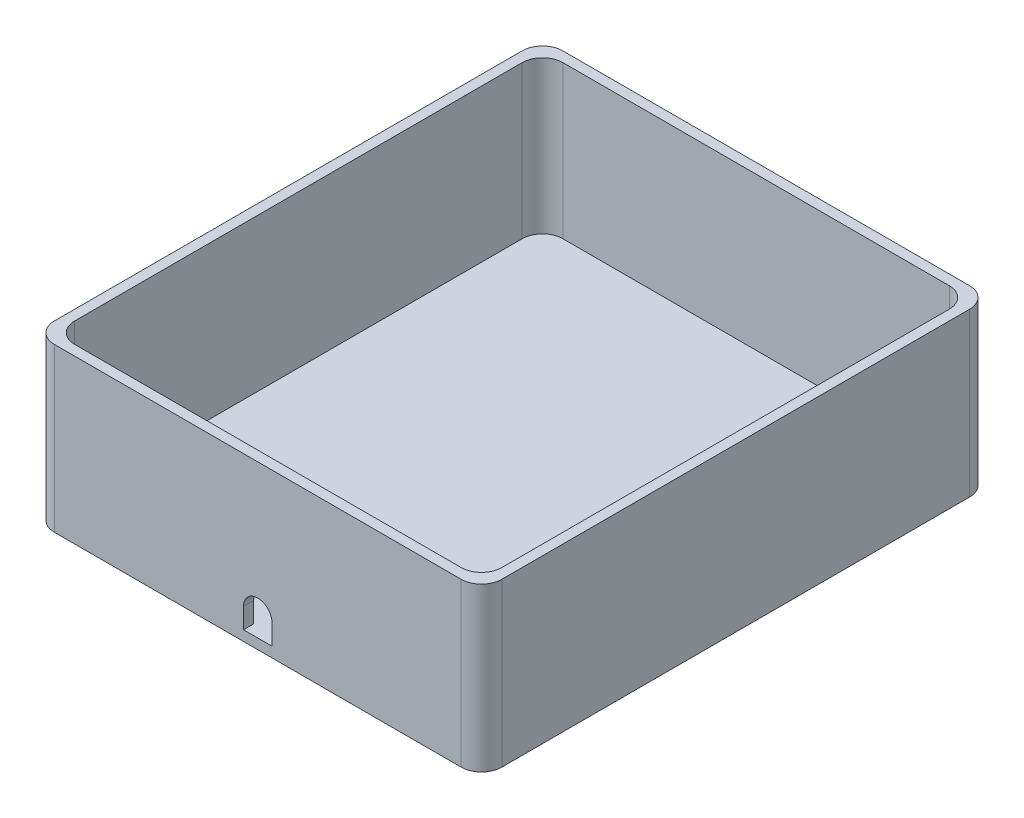
ISO-10303-21;
HEADER;
FILE_DESCRIPTION(('STEP AP214'),'2;1');
FILE_NAME('part.step','',(''),(''),'','','');
FILE_SCHEMA(('AUTOMOTIVE_DESIGN { 1 0 10303 214 1 1 1 1 }'));
ENDSEC;
DATA;
#1=APPLICATION_CONTEXT('core data for automotive mechanical design processes');
#2=APPLICATION_PROTOCOL_DEFINITION('international standard','automotive_design',2000,#1);
#3=PRODUCT_CONTEXT('',#1,'mechanical');
#4=PRODUCT('Part','Part','',(#3));
#5=PRODUCT_RELATED_PRODUCT_CATEGORY('part','',(#4));
#6=PRODUCT_DEFINITION_FORMATION('','',#4);
#7=PRODUCT_DEFINITION_CONTEXT('part definition',#1,'design');
#8=PRODUCT_DEFINITION('design','',#6,#7);
#9=PRODUCT_DEFINITION_SHAPE('','',#8);
#10=(LENGTH_UNIT() NAMED_UNIT(*) SI_UNIT(.MILLI.,.METRE.));
#11=(NAMED_UNIT(*) PLANE_ANGLE_UNIT() SI_UNIT($,.RADIAN.));
#12=(NAMED_UNIT(*) SI_UNIT($,.STERADIAN.) SOLID_ANGLE_UNIT());
#13=UNCERTAINTY_MEASURE_WITH_UNIT(LENGTH_MEASURE(1.E-05),#10,'distance_accuracy_value','');
#14=(GEOMETRIC_REPRESENTATION_CONTEXT(3) GLOBAL_UNCERTAINTY_ASSIGNED_CONTEXT((#13)) GLOBAL_UNIT_ASSIGNED_CONTEXT((#10,
#11,#12)) REPRESENTATION_CONTEXT('',''));
#15=CARTESIAN_POINT('',(0.,0.,0.));
#16=DIRECTION('',(0.,0.,1.));
#17=DIRECTION('',(1.,0.,0.));
#18=AXIS2_PLACEMENT_3D('',#15,#16,#17);
#19=CARTESIAN_POINT('',(-110.,80.,125.));
#20=DIRECTION('',(1.,0.,0.));
#21=DIRECTION('',(0.,0.,-1.));
#22=AXIS2_PLACEMENT_3D('',#19,#20,#21);
#23=PLANE('',#22);
#24=DIRECTION('',(0.,0.,1.));
#25=VECTOR('',#24,1.);
#26=CARTESIAN_POINT('',(-110.,80.,125.));
#27=LINE('',#26,#25);
#28=CARTESIAN_POINT('',(-110.,80.,-115.));
#29=VERTEX_POINT('',#28);
#30=CARTESIAN_POINT('',(-110.,80.,115.));
#31=VERTEX_POINT('',#30);
#32=EDGE_CURVE('E227',#29,#31,#27,.T.);
#33=ORIENTED_EDGE('',*,*,#32,.F.);
#34=DIRECTION('',(0.,-1.,0.));
#35=VECTOR('',#34,1.);
#36=CARTESIAN_POINT('',(-110.,80.,-115.));
#37=LINE('',#36,#35);
#38=CARTESIAN_POINT('',(-110.,0.,-115.));
#39=VERTEX_POINT('',#38);
#40=EDGE_CURVE('E276',#29,#39,#37,.T.);
#41=ORIENTED_EDGE('',*,*,#40,.T.);
#42=DIRECTION('',(0.,0.,1.));
#43=VECTOR('',#42,1.);
#44=CARTESIAN_POINT('',(-110.,0.,125.));
#45=LINE('',#44,#43);
#46=CARTESIAN_POINT('',(-110.,0.,115.));
#47=VERTEX_POINT('',#46);
#48=EDGE_CURVE('E216',#39,#47,#45,.T.);
#49=ORIENTED_EDGE('',*,*,#48,.T.);
#50=DIRECTION('',(0.,-1.,0.));
#51=VECTOR('',#50,1.);
#52=CARTESIAN_POINT('',(-110.,80.,115.));
#53=LINE('',#52,#51);
#54=EDGE_CURVE('E274',#47,#31,#53,.F.);
#55=ORIENTED_EDGE('',*,*,#54,.T.);
#56=EDGE_LOOP('',(#33,#41,#49,#55));
#57=FACE_BOUND('',#56,.T.);
#58=ADVANCED_FACE('F33',(#57),#23,.F.);
#59=CARTESIAN_POINT('',(110.,80.,125.));
#60=DIRECTION('',(0.,0.,-1.));
#61=DIRECTION('',(-1.,0.,0.));
#62=AXIS2_PLACEMENT_3D('',#59,#60,#61);
#63=PLANE('',#62);
#64=DIRECTION('',(0.,-1.,0.));
#65=VECTOR('',#64,1.);
#66=CARTESIAN_POINT('',(-7.,5.,125.));
#67=LINE('',#66,#65);
#68=CARTESIAN_POINT('',(-7.00000000000001,15.,125.));
#69=VERTEX_POINT('',#68);
#70=CARTESIAN_POINT('',(-7.,5.,125.));
#71=VERTEX_POINT('',#70);
#72=EDGE_CURVE('E182',#69,#71,#67,.T.);
#73=ORIENTED_EDGE('',*,*,#72,.F.);
#74=CARTESIAN_POINT('',(0.,15.,125.));
#75=DIRECTION('',(0.,0.,1.));
#76=DIRECTION('',(1.,0.,0.));
#77=AXIS2_PLACEMENT_3D('',#74,#75,#76);
#78=CIRCLE('',#77,7.);
#79=CARTESIAN_POINT('',(7.,15.,125.));
#80=VERTEX_POINT('',#79);
#81=EDGE_CURVE('E48',#80,#69,#78,.T.);
#82=ORIENTED_EDGE('',*,*,#81,.F.);
#83=DIRECTION('',(0.,1.,0.));
#84=VECTOR('',#83,1.);
#85=CARTESIAN_POINT('',(7.,5.,125.));
#86=LINE('',#85,#84);
#87=CARTESIAN_POINT('',(7.,5.,125.));
#88=VERTEX_POINT('',#87);
#89=EDGE_CURVE('E189',#88,#80,#86,.T.);
#90=ORIENTED_EDGE('',*,*,#89,.F.);
#91=DIRECTION('',(1.,0.,0.));
#92=VECTOR('',#91,1.);
#93=CARTESIAN_POINT('',(-7.,5.,125.));
#94=LINE('',#93,#92);
#95=EDGE_CURVE('E174',#71,#88,#94,.T.);
#96=ORIENTED_EDGE('',*,*,#95,.F.);
#97=EDGE_LOOP('',(#73,#82,#90,#96));
#98=FACE_BOUND('',#97,.T.);
#99=DIRECTION('',(1.,0.,0.));
#100=VECTOR('',#99,1.);
#101=CARTESIAN_POINT('',(110.,80.,125.));
#102=LINE('',#101,#100);
#103=CARTESIAN_POINT('',(-100.,80.,125.));
#104=VERTEX_POINT('',#103);
#105=CARTESIAN_POINT('',(100.,80.,125.));
#106=VERTEX_POINT('',#105);
#107=EDGE_CURVE('E230',#104,#106,#102,.T.);
#108=ORIENTED_EDGE('',*,*,#107,.F.);
#109=DIRECTION('',(0.,-1.,0.));
#110=VECTOR('',#109,1.);
#111=CARTESIAN_POINT('',(-100.,80.,125.));
#112=LINE('',#111,#110);
#113=CARTESIAN_POINT('',(-100.,0.,125.));
#114=VERTEX_POINT('',#113);
#115=EDGE_CURVE('E312',#104,#114,#112,.T.);
#116=ORIENTED_EDGE('',*,*,#115,.T.);
#117=DIRECTION('',(1.,0.,0.));
#118=VECTOR('',#117,1.);
#119=CARTESIAN_POINT('',(110.,0.,125.));
#120=LINE('',#119,#118);
#121=CARTESIAN_POINT('',(100.,0.,125.));
#122=VERTEX_POINT('',#121);
#123=EDGE_CURVE('E243',#114,#122,#120,.T.);
#124=ORIENTED_EDGE('',*,*,#123,.T.);
#125=DIRECTION('',(0.,-1.,0.));
#126=VECTOR('',#125,1.);
#127=CARTESIAN_POINT('',(100.,80.,125.));
#128=LINE('',#127,#126);
#129=EDGE_CURVE('E310',#122,#106,#128,.F.);
#130=ORIENTED_EDGE('',*,*,#129,.T.);
#131=EDGE_LOOP('',(#108,#116,#124,#130));
#132=FACE_BOUND('',#131,.T.);
#133=ADVANCED_FACE('F186',(#98,#132),#63,.F.);
#134=CARTESIAN_POINT('',(110.,80.,125.));
#135=DIRECTION('',(-1.,0.,0.));
#136=DIRECTION('',(0.,0.,1.));
#137=AXIS2_PLACEMENT_3D('',#134,#135,#136);
#138=PLANE('',#137);
#139=DIRECTION('',(0.,0.,-1.));
#140=VECTOR('',#139,1.);
#141=CARTESIAN_POINT('',(110.,0.,125.));
#142=LINE('',#141,#140);
#143=CARTESIAN_POINT('',(110.,0.,115.));
#144=VERTEX_POINT('',#143);
#145=CARTESIAN_POINT('',(110.,0.,-115.));
#146=VERTEX_POINT('',#145);
#147=EDGE_CURVE('E246',#144,#146,#142,.T.);
#148=ORIENTED_EDGE('',*,*,#147,.T.);
#149=DIRECTION('',(0.,-1.,0.));
#150=VECTOR('',#149,1.);
#151=CARTESIAN_POINT('',(110.,80.,-115.));
#152=LINE('',#151,#150);
#153=CARTESIAN_POINT('',(110.,80.,-115.));
#154=VERTEX_POINT('',#153);
#155=EDGE_CURVE('E308',#146,#154,#152,.F.);
#156=ORIENTED_EDGE('',*,*,#155,.T.);
#157=DIRECTION('',(0.,0.,-1.));
#158=VECTOR('',#157,1.);
#159=CARTESIAN_POINT('',(110.,80.,125.));
#160=LINE('',#159,#158);
#161=CARTESIAN_POINT('',(110.,80.,115.));
#162=VERTEX_POINT('',#161);
#163=EDGE_CURVE('E234',#162,#154,#160,.T.);
#164=ORIENTED_EDGE('',*,*,#163,.F.);
#165=DIRECTION('',(0.,-1.,0.));
#166=VECTOR('',#165,1.);
#167=CARTESIAN_POINT('',(110.,80.,115.));
#168=LINE('',#167,#166);
#169=EDGE_CURVE('E305',#162,#144,#168,.T.);
#170=ORIENTED_EDGE('',*,*,#169,.T.);
#171=EDGE_LOOP('',(#148,#156,#164,#170));
#172=FACE_BOUND('',#171,.T.);
#173=ADVANCED_FACE('F381',(#172),#138,.F.);
#174=CARTESIAN_POINT('',(110.,80.,-125.));
#175=DIRECTION('',(0.,0.,1.));
#176=DIRECTION('',(1.,0.,0.));
#177=AXIS2_PLACEMENT_3D('',#174,#175,#176);
#178=PLANE('',#177);
#179=DIRECTION('',(-1.,0.,0.));
#180=VECTOR('',#179,1.);
#181=CARTESIAN_POINT('',(110.,0.,-125.));
#182=LINE('',#181,#180);
#183=CARTESIAN_POINT('',(100.,0.,-125.));
#184=VERTEX_POINT('',#183);
#185=CARTESIAN_POINT('',(-100.,0.,-125.));
#186=VERTEX_POINT('',#185);
#187=EDGE_CURVE('E231',#184,#186,#182,.T.);
#188=ORIENTED_EDGE('',*,*,#187,.T.);
#189=DIRECTION('',(0.,-1.,0.));
#190=VECTOR('',#189,1.);
#191=CARTESIAN_POINT('',(-100.,80.,-125.));
#192=LINE('',#191,#190);
#193=CARTESIAN_POINT('',(-100.,80.,-125.));
#194=VERTEX_POINT('',#193);
#195=EDGE_CURVE('E290',#186,#194,#192,.F.);
#196=ORIENTED_EDGE('',*,*,#195,.T.);
#197=DIRECTION('',(-1.,0.,0.));
#198=VECTOR('',#197,1.);
#199=CARTESIAN_POINT('',(110.,80.,-125.));
#200=LINE('',#199,#198);
#201=CARTESIAN_POINT('',(100.,80.,-125.));
#202=VERTEX_POINT('',#201);
#203=EDGE_CURVE('E237',#202,#194,#200,.T.);
#204=ORIENTED_EDGE('',*,*,#203,.F.);
#205=DIRECTION('',(0.,-1.,0.));
#206=VECTOR('',#205,1.);
#207=CARTESIAN_POINT('',(100.,80.,-125.));
#208=LINE('',#207,#206);
#209=EDGE_CURVE('E287',#202,#184,#208,.T.);
#210=ORIENTED_EDGE('',*,*,#209,.T.);
#211=EDGE_LOOP('',(#188,#196,#204,#210));
#212=FACE_BOUND('',#211,.T.);
#213=ADVANCED_FACE('F497',(#212),#178,.F.);
#214=CARTESIAN_POINT('',(0.,80.,0.));
#215=DIRECTION('',(0.,1.,0.));
#216=DIRECTION('',(0.,0.,1.));
#217=AXIS2_PLACEMENT_3D('',#214,#215,#216);
#218=PLANE('',#217);
#219=DIRECTION('',(0.,0.,1.));
#220=VECTOR('',#219,1.);
#221=CARTESIAN_POINT('',(-105.,80.,120.));
#222=LINE('',#221,#220);
#223=CARTESIAN_POINT('',(-105.,80.,-110.));
#224=VERTEX_POINT('',#223);
#225=CARTESIAN_POINT('',(-105.,80.,110.));
#226=VERTEX_POINT('',#225);
#227=EDGE_CURVE('E203',#224,#226,#222,.T.);
#228=ORIENTED_EDGE('',*,*,#227,.F.);
#229=CARTESIAN_POINT('',(-95.,80.,-110.));
#230=DIRECTION('',(0.,1.,0.));
#231=DIRECTION('',(0.,0.,1.));
#232=AXIS2_PLACEMENT_3D('',#229,#230,#231);
#233=CIRCLE('',#232,10.);
#234=CARTESIAN_POINT('',(-95.,80.,-120.));
#235=VERTEX_POINT('',#234);
#236=EDGE_CURVE('E41',#224,#235,#233,.F.);
#237=ORIENTED_EDGE('',*,*,#236,.T.);
#238=DIRECTION('',(-1.,0.,0.));
#239=VECTOR('',#238,1.);
#240=CARTESIAN_POINT('',(105.,80.,-120.));
#241=LINE('',#240,#239);
#242=CARTESIAN_POINT('',(95.,80.,-120.));
#243=VERTEX_POINT('',#242);
#244=EDGE_CURVE('E208',#243,#235,#241,.T.);
#245=ORIENTED_EDGE('',*,*,#244,.F.);
#246=CARTESIAN_POINT('',(95.,80.,-110.));
#247=DIRECTION('',(0.,1.,0.));
#248=DIRECTION('',(0.,0.,1.));
#249=AXIS2_PLACEMENT_3D('',#246,#247,#248);
#250=CIRCLE('',#249,10.);
#251=CARTESIAN_POINT('',(105.,80.,-110.));
#252=VERTEX_POINT('',#251);
#253=EDGE_CURVE('E319',#243,#252,#250,.F.);
#254=ORIENTED_EDGE('',*,*,#253,.T.);
#255=DIRECTION('',(0.,0.,-1.));
#256=VECTOR('',#255,1.);
#257=CARTESIAN_POINT('',(105.,80.,120.));
#258=LINE('',#257,#256);
#259=CARTESIAN_POINT('',(105.,80.,110.));
#260=VERTEX_POINT('',#259);
#261=EDGE_CURVE('E222',#260,#252,#258,.T.);
#262=ORIENTED_EDGE('',*,*,#261,.F.);
#263=CARTESIAN_POINT('',(95.,80.,110.));
#264=DIRECTION('',(0.,1.,0.));
#265=DIRECTION('',(0.,0.,1.));
#266=AXIS2_PLACEMENT_3D('',#263,#264,#265);
#267=CIRCLE('',#266,10.);
#268=CARTESIAN_POINT('',(95.,80.,120.));
#269=VERTEX_POINT('',#268);
#270=EDGE_CURVE('E317',#260,#269,#267,.F.);
#271=ORIENTED_EDGE('',*,*,#270,.T.);
#272=DIRECTION('',(1.,0.,0.));
#273=VECTOR('',#272,1.);
#274=CARTESIAN_POINT('',(105.,80.,120.));
#275=LINE('',#274,#273);
#276=CARTESIAN_POINT('',(-95.,80.,120.));
#277=VERTEX_POINT('',#276);
#278=EDGE_CURVE('E219',#277,#269,#275,.T.);
#279=ORIENTED_EDGE('',*,*,#278,.F.);
#280=CARTESIAN_POINT('',(-95.,80.,110.));
#281=DIRECTION('',(0.,1.,0.));
#282=DIRECTION('',(0.,0.,1.));
#283=AXIS2_PLACEMENT_3D('',#280,#281,#282);
#284=CIRCLE('',#283,10.);
#285=EDGE_CURVE('E315',#277,#226,#284,.F.);
#286=ORIENTED_EDGE('',*,*,#285,.T.);
#287=EDGE_LOOP('',(#228,#237,#245,#254,#262,#271,#279,#286));
#288=FACE_BOUND('',#287,.T.);
#289=ORIENTED_EDGE('',*,*,#203,.T.);
#290=CARTESIAN_POINT('',(-100.,80.,-115.));
#291=DIRECTION('',(0.,1.,0.));
#292=DIRECTION('',(0.,0.,1.));
#293=AXIS2_PLACEMENT_3D('',#290,#291,#292);
#294=CIRCLE('',#293,10.);
#295=EDGE_CURVE('E298',#194,#29,#294,.T.);
#296=ORIENTED_EDGE('',*,*,#295,.T.);
#297=ORIENTED_EDGE('',*,*,#32,.T.);
#298=CARTESIAN_POINT('',(-100.,80.,115.));
#299=DIRECTION('',(0.,1.,0.));
#300=DIRECTION('',(0.,0.,1.));
#301=AXIS2_PLACEMENT_3D('',#298,#299,#300);
#302=CIRCLE('',#301,10.);
#303=EDGE_CURVE('E294',#31,#104,#302,.T.);
#304=ORIENTED_EDGE('',*,*,#303,.T.);
#305=ORIENTED_EDGE('',*,*,#107,.T.);
#306=CARTESIAN_POINT('',(100.,80.,115.));
#307=DIRECTION('',(0.,1.,0.));
#308=DIRECTION('',(0.,0.,1.));
#309=AXIS2_PLACEMENT_3D('',#306,#307,#308);
#310=CIRCLE('',#309,10.);
#311=EDGE_CURVE('E292',#106,#162,#310,.T.);
#312=ORIENTED_EDGE('',*,*,#311,.T.);
#313=ORIENTED_EDGE('',*,*,#163,.T.);
#314=CARTESIAN_POINT('',(100.,80.,-115.));
#315=DIRECTION('',(0.,1.,0.));
#316=DIRECTION('',(0.,0.,1.));
#317=AXIS2_PLACEMENT_3D('',#314,#315,#316);
#318=CIRCLE('',#317,10.);
#319=EDGE_CURVE('E296',#154,#202,#318,.T.);
#320=ORIENTED_EDGE('',*,*,#319,.T.);
#321=EDGE_LOOP('',(#289,#296,#297,#304,#305,#312,#313,#320));
#322=FACE_BOUND('',#321,.T.);
#323=ADVANCED_FACE('F323',(#288,#322),#218,.T.);
#324=CARTESIAN_POINT('',(0.,0.,0.));
#325=DIRECTION('',(0.,1.,0.));
#326=DIRECTION('',(0.,0.,1.));
#327=AXIS2_PLACEMENT_3D('',#324,#325,#326);
#328=PLANE('',#327);
#329=ORIENTED_EDGE('',*,*,#48,.F.);
#330=CARTESIAN_POINT('',(-100.,0.,-115.));
#331=DIRECTION('',(0.,1.,0.));
#332=DIRECTION('',(0.,0.,1.));
#333=AXIS2_PLACEMENT_3D('',#330,#331,#332);
#334=CIRCLE('',#333,10.);
#335=EDGE_CURVE('E285',#39,#186,#334,.F.);
#336=ORIENTED_EDGE('',*,*,#335,.T.);
#337=ORIENTED_EDGE('',*,*,#187,.F.);
#338=CARTESIAN_POINT('',(100.,0.,-115.));
#339=DIRECTION('',(0.,1.,0.));
#340=DIRECTION('',(0.,0.,1.));
#341=AXIS2_PLACEMENT_3D('',#338,#339,#340);
#342=CIRCLE('',#341,10.);
#343=EDGE_CURVE('E283',#184,#146,#342,.F.);
#344=ORIENTED_EDGE('',*,*,#343,.T.);
#345=ORIENTED_EDGE('',*,*,#147,.F.);
#346=CARTESIAN_POINT('',(100.,0.,115.));
#347=DIRECTION('',(0.,1.,0.));
#348=DIRECTION('',(0.,0.,1.));
#349=AXIS2_PLACEMENT_3D('',#346,#347,#348);
#350=CIRCLE('',#349,10.);
#351=EDGE_CURVE('E279',#144,#122,#350,.F.);
#352=ORIENTED_EDGE('',*,*,#351,.T.);
#353=ORIENTED_EDGE('',*,*,#123,.F.);
#354=CARTESIAN_POINT('',(-100.,0.,115.));
#355=DIRECTION('',(0.,1.,0.));
#356=DIRECTION('',(0.,0.,1.));
#357=AXIS2_PLACEMENT_3D('',#354,#355,#356);
#358=CIRCLE('',#357,10.);
#359=EDGE_CURVE('E281',#114,#47,#358,.F.);
#360=ORIENTED_EDGE('',*,*,#359,.T.);
#361=EDGE_LOOP('',(#329,#336,#337,#344,#345,#352,#353,#360));
#362=FACE_BOUND('',#361,.T.);
#363=ADVANCED_FACE('F494',(#362),#328,.F.);
#364=CARTESIAN_POINT('',(-105.,5.,120.));
#365=DIRECTION('',(-1.,0.,0.));
#366=DIRECTION('',(0.,0.,1.));
#367=AXIS2_PLACEMENT_3D('',#364,#365,#366);
#368=PLANE('',#367);
#369=ORIENTED_EDGE('',*,*,#227,.T.);
#370=DIRECTION('',(0.,1.,0.));
#371=VECTOR('',#370,1.);
#372=CARTESIAN_POINT('',(-105.,5.,110.));
#373=LINE('',#372,#371);
#374=CARTESIAN_POINT('',(-105.,5.,110.));
#375=VERTEX_POINT('',#374);
#376=EDGE_CURVE('E259',#226,#375,#373,.F.);
#377=ORIENTED_EDGE('',*,*,#376,.T.);
#378=DIRECTION('',(0.,0.,1.));
#379=VECTOR('',#378,1.);
#380=CARTESIAN_POINT('',(-105.,5.,120.));
#381=LINE('',#380,#379);
#382=CARTESIAN_POINT('',(-105.,5.,-110.));
#383=VERTEX_POINT('',#382);
#384=EDGE_CURVE('E204',#383,#375,#381,.T.);
#385=ORIENTED_EDGE('',*,*,#384,.F.);
#386=DIRECTION('',(0.,1.,0.));
#387=VECTOR('',#386,1.);
#388=CARTESIAN_POINT('',(-105.,80.,-110.));
#389=LINE('',#388,#387);
#390=EDGE_CURVE('E256',#383,#224,#389,.T.);
#391=ORIENTED_EDGE('',*,*,#390,.T.);
#392=EDGE_LOOP('',(#369,#377,#385,#391));
#393=FACE_BOUND('',#392,.T.);
#394=ADVANCED_FACE('F337',(#393),#368,.F.);
#395=CARTESIAN_POINT('',(105.,5.,-120.));
#396=DIRECTION('',(0.,0.,-1.));
#397=DIRECTION('',(-1.,0.,0.));
#398=AXIS2_PLACEMENT_3D('',#395,#396,#397);
#399=PLANE('',#398);
#400=DIRECTION('',(-1.,0.,0.));
#401=VECTOR('',#400,1.);
#402=CARTESIAN_POINT('',(105.,5.,-120.));
#403=LINE('',#402,#401);
#404=CARTESIAN_POINT('',(95.,5.,-120.));
#405=VERTEX_POINT('',#404);
#406=CARTESIAN_POINT('',(-95.,5.,-120.));
#407=VERTEX_POINT('',#406);
#408=EDGE_CURVE('E213',#405,#407,#403,.T.);
#409=ORIENTED_EDGE('',*,*,#408,.F.);
#410=DIRECTION('',(0.,1.,0.));
#411=VECTOR('',#410,1.);
#412=CARTESIAN_POINT('',(95.,80.,-120.));
#413=LINE('',#412,#411);
#414=EDGE_CURVE('E302',#405,#243,#413,.T.);
#415=ORIENTED_EDGE('',*,*,#414,.T.);
#416=ORIENTED_EDGE('',*,*,#244,.T.);
#417=DIRECTION('',(0.,1.,0.));
#418=VECTOR('',#417,1.);
#419=CARTESIAN_POINT('',(-95.,5.,-120.));
#420=LINE('',#419,#418);
#421=EDGE_CURVE('E300',#235,#407,#420,.F.);
#422=ORIENTED_EDGE('',*,*,#421,.T.);
#423=EDGE_LOOP('',(#409,#415,#416,#422));
#424=FACE_BOUND('',#423,.T.);
#425=ADVANCED_FACE('F330',(#424),#399,.F.);
#426=CARTESIAN_POINT('',(105.,5.,120.));
#427=DIRECTION('',(1.,0.,0.));
#428=DIRECTION('',(0.,0.,-1.));
#429=AXIS2_PLACEMENT_3D('',#426,#427,#428);
#430=PLANE('',#429);
#431=DIRECTION('',(0.,0.,-1.));
#432=VECTOR('',#431,1.);
#433=CARTESIAN_POINT('',(105.,5.,120.));
#434=LINE('',#433,#432);
#435=CARTESIAN_POINT('',(105.,5.,110.));
#436=VERTEX_POINT('',#435);
#437=CARTESIAN_POINT('',(105.,5.,-110.));
#438=VERTEX_POINT('',#437);
#439=EDGE_CURVE('E210',#436,#438,#434,.T.);
#440=ORIENTED_EDGE('',*,*,#439,.F.);
#441=DIRECTION('',(0.,1.,0.));
#442=VECTOR('',#441,1.);
#443=CARTESIAN_POINT('',(105.,80.,110.));
#444=LINE('',#443,#442);
#445=EDGE_CURVE('E271',#436,#260,#444,.T.);
#446=ORIENTED_EDGE('',*,*,#445,.T.);
#447=ORIENTED_EDGE('',*,*,#261,.T.);
#448=DIRECTION('',(0.,1.,0.));
#449=VECTOR('',#448,1.);
#450=CARTESIAN_POINT('',(105.,5.,-110.));
#451=LINE('',#450,#449);
#452=EDGE_CURVE('E269',#252,#438,#451,.F.);
#453=ORIENTED_EDGE('',*,*,#452,.T.);
#454=EDGE_LOOP('',(#440,#446,#447,#453));
#455=FACE_BOUND('',#454,.T.);
#456=ADVANCED_FACE('F357',(#455),#430,.F.);
#457=CARTESIAN_POINT('',(105.,5.,120.));
#458=DIRECTION('',(0.,0.,1.));
#459=DIRECTION('',(1.,0.,0.));
#460=AXIS2_PLACEMENT_3D('',#457,#458,#459);
#461=PLANE('',#460);
#462=DIRECTION('',(1.,0.,0.));
#463=VECTOR('',#462,1.);
#464=CARTESIAN_POINT('',(105.,5.,120.));
#465=LINE('',#464,#463);
#466=CARTESIAN_POINT('',(7.,5.,120.));
#467=VERTEX_POINT('',#466);
#468=CARTESIAN_POINT('',(95.,5.,120.));
#469=VERTEX_POINT('',#468);
#470=EDGE_CURVE('E207',#467,#469,#465,.T.);
#471=ORIENTED_EDGE('',*,*,#470,.F.);
#472=DIRECTION('',(0.,1.,0.));
#473=VECTOR('',#472,1.);
#474=CARTESIAN_POINT('',(7.00000000000001,5.,120.));
#475=LINE('',#474,#473);
#476=CARTESIAN_POINT('',(7.,15.,120.));
#477=VERTEX_POINT('',#476);
#478=EDGE_CURVE('E200',#467,#477,#475,.T.);
#479=ORIENTED_EDGE('',*,*,#478,.T.);
#480=CARTESIAN_POINT('',(0.,15.,120.));
#481=DIRECTION('',(0.,0.,1.));
#482=DIRECTION('',(1.,0.,0.));
#483=AXIS2_PLACEMENT_3D('',#480,#481,#482);
#484=CIRCLE('',#483,7.);
#485=CARTESIAN_POINT('',(-7.,15.,120.));
#486=VERTEX_POINT('',#485);
#487=EDGE_CURVE('E11',#477,#486,#484,.T.);
#488=ORIENTED_EDGE('',*,*,#487,.T.);
#489=DIRECTION('',(0.,-1.,0.));
#490=VECTOR('',#489,1.);
#491=CARTESIAN_POINT('',(-7.00000000000001,5.,120.));
#492=LINE('',#491,#490);
#493=CARTESIAN_POINT('',(-7.00000000000001,5.,120.));
#494=VERTEX_POINT('',#493);
#495=EDGE_CURVE('E196',#486,#494,#492,.T.);
#496=ORIENTED_EDGE('',*,*,#495,.T.);
#497=CARTESIAN_POINT('',(-95.,5.,120.));
#498=VERTEX_POINT('',#497);
#499=EDGE_CURVE('E177',#498,#494,#465,.T.);
#500=ORIENTED_EDGE('',*,*,#499,.F.);
#501=DIRECTION('',(0.,1.,0.));
#502=VECTOR('',#501,1.);
#503=CARTESIAN_POINT('',(-95.,80.,120.));
#504=LINE('',#503,#502);
#505=EDGE_CURVE('E253',#498,#277,#504,.T.);
#506=ORIENTED_EDGE('',*,*,#505,.T.);
#507=ORIENTED_EDGE('',*,*,#278,.T.);
#508=DIRECTION('',(0.,1.,0.));
#509=VECTOR('',#508,1.);
#510=CARTESIAN_POINT('',(95.,5.,120.));
#511=LINE('',#510,#509);
#512=EDGE_CURVE('E240',#269,#469,#511,.F.);
#513=ORIENTED_EDGE('',*,*,#512,.T.);
#514=EDGE_LOOP('',(#471,#479,#488,#496,#500,#506,#507,#513));
#515=FACE_BOUND('',#514,.T.);
#516=ADVANCED_FACE('F344',(#515),#461,.F.);
#517=CARTESIAN_POINT('',(0.,5.,0.));
#518=DIRECTION('',(0.,1.,0.));
#519=DIRECTION('',(0.,0.,1.));
#520=AXIS2_PLACEMENT_3D('',#517,#518,#519);
#521=PLANE('',#520);
#522=ORIENTED_EDGE('',*,*,#499,.T.);
#523=DIRECTION('',(0.,0.,1.));
#524=VECTOR('',#523,1.);
#525=CARTESIAN_POINT('',(-7.,5.,50.));
#526=LINE('',#525,#524);
#527=EDGE_CURVE('E56',#494,#71,#526,.T.);
#528=ORIENTED_EDGE('',*,*,#527,.T.);
#529=ORIENTED_EDGE('',*,*,#95,.T.);
#530=DIRECTION('',(0.,0.,1.));
#531=VECTOR('',#530,1.);
#532=CARTESIAN_POINT('',(7.,5.,50.));
#533=LINE('',#532,#531);
#534=EDGE_CURVE('E178',#467,#88,#533,.T.);
#535=ORIENTED_EDGE('',*,*,#534,.F.);
#536=ORIENTED_EDGE('',*,*,#470,.T.);
#537=CARTESIAN_POINT('',(95.,5.,110.));
#538=DIRECTION('',(0.,1.,0.));
#539=DIRECTION('',(0.,0.,1.));
#540=AXIS2_PLACEMENT_3D('',#537,#538,#539);
#541=CIRCLE('',#540,10.);
#542=EDGE_CURVE('E265',#469,#436,#541,.T.);
#543=ORIENTED_EDGE('',*,*,#542,.T.);
#544=ORIENTED_EDGE('',*,*,#439,.T.);
#545=CARTESIAN_POINT('',(95.,5.,-110.));
#546=DIRECTION('',(0.,1.,0.));
#547=DIRECTION('',(0.,0.,1.));
#548=AXIS2_PLACEMENT_3D('',#545,#546,#547);
#549=CIRCLE('',#548,10.);
#550=EDGE_CURVE('E263',#438,#405,#549,.T.);
#551=ORIENTED_EDGE('',*,*,#550,.T.);
#552=ORIENTED_EDGE('',*,*,#408,.T.);
#553=CARTESIAN_POINT('',(-95.,5.,-110.));
#554=DIRECTION('',(0.,1.,0.));
#555=DIRECTION('',(0.,0.,1.));
#556=AXIS2_PLACEMENT_3D('',#553,#554,#555);
#557=CIRCLE('',#556,10.);
#558=EDGE_CURVE('E261',#407,#383,#557,.T.);
#559=ORIENTED_EDGE('',*,*,#558,.T.);
#560=ORIENTED_EDGE('',*,*,#384,.T.);
#561=CARTESIAN_POINT('',(-95.,5.,110.));
#562=DIRECTION('',(0.,1.,0.));
#563=DIRECTION('',(0.,0.,1.));
#564=AXIS2_PLACEMENT_3D('',#561,#562,#563);
#565=CIRCLE('',#564,10.);
#566=EDGE_CURVE('E267',#375,#498,#565,.T.);
#567=ORIENTED_EDGE('',*,*,#566,.T.);
#568=EDGE_LOOP('',(#522,#528,#529,#535,#536,#543,#544,#551,#552,#559,#560,#567));
#569=FACE_BOUND('',#568,.T.);
#570=ADVANCED_FACE('F171',(#569),#521,.T.);
#571=CARTESIAN_POINT('',(-95.,5.,110.));
#572=DIRECTION('',(0.,-1.,0.));
#573=DIRECTION('',(0.,0.,-1.));
#574=AXIS2_PLACEMENT_3D('',#571,#572,#573);
#575=CYLINDRICAL_SURFACE('',#574,10.);
#576=ORIENTED_EDGE('',*,*,#566,.F.);
#577=ORIENTED_EDGE('',*,*,#376,.F.);
#578=ORIENTED_EDGE('',*,*,#285,.F.);
#579=ORIENTED_EDGE('',*,*,#505,.F.);
#580=EDGE_LOOP('',(#576,#577,#578,#579));
#581=FACE_BOUND('',#580,.T.);
#582=ADVANCED_FACE('F340',(#581),#575,.F.);
#583=CARTESIAN_POINT('',(95.,5.,110.));
#584=DIRECTION('',(0.,-1.,0.));
#585=DIRECTION('',(0.,0.,-1.));
#586=AXIS2_PLACEMENT_3D('',#583,#584,#585);
#587=CYLINDRICAL_SURFACE('',#586,10.);
#588=ORIENTED_EDGE('',*,*,#542,.F.);
#589=ORIENTED_EDGE('',*,*,#512,.F.);
#590=ORIENTED_EDGE('',*,*,#270,.F.);
#591=ORIENTED_EDGE('',*,*,#445,.F.);
#592=EDGE_LOOP('',(#588,#589,#590,#591));
#593=FACE_BOUND('',#592,.T.);
#594=ADVANCED_FACE('F360',(#593),#587,.F.);
#595=CARTESIAN_POINT('',(-100.,80.,-115.));
#596=DIRECTION('',(0.,-1.,0.));
#597=DIRECTION('',(0.,0.,-1.));
#598=AXIS2_PLACEMENT_3D('',#595,#596,#597);
#599=CYLINDRICAL_SURFACE('',#598,10.);
#600=ORIENTED_EDGE('',*,*,#295,.F.);
#601=ORIENTED_EDGE('',*,*,#195,.F.);
#602=ORIENTED_EDGE('',*,*,#335,.F.);
#603=ORIENTED_EDGE('',*,*,#40,.F.);
#604=EDGE_LOOP('',(#600,#601,#602,#603));
#605=FACE_BOUND('',#604,.T.);
#606=ADVANCED_FACE('F365',(#605),#599,.T.);
#607=CARTESIAN_POINT('',(95.,5.,-110.));
#608=DIRECTION('',(0.,-1.,0.));
#609=DIRECTION('',(0.,0.,-1.));
#610=AXIS2_PLACEMENT_3D('',#607,#608,#609);
#611=CYLINDRICAL_SURFACE('',#610,10.);
#612=ORIENTED_EDGE('',*,*,#550,.F.);
#613=ORIENTED_EDGE('',*,*,#452,.F.);
#614=ORIENTED_EDGE('',*,*,#253,.F.);
#615=ORIENTED_EDGE('',*,*,#414,.F.);
#616=EDGE_LOOP('',(#612,#613,#614,#615));
#617=FACE_BOUND('',#616,.T.);
#618=ADVANCED_FACE('F362',(#617),#611,.F.);
#619=CARTESIAN_POINT('',(100.,80.,-115.));
#620=DIRECTION('',(0.,-1.,0.));
#621=DIRECTION('',(0.,0.,-1.));
#622=AXIS2_PLACEMENT_3D('',#619,#620,#621);
#623=CYLINDRICAL_SURFACE('',#622,10.);
#624=ORIENTED_EDGE('',*,*,#319,.F.);
#625=ORIENTED_EDGE('',*,*,#155,.F.);
#626=ORIENTED_EDGE('',*,*,#343,.F.);
#627=ORIENTED_EDGE('',*,*,#209,.F.);
#628=EDGE_LOOP('',(#624,#625,#626,#627));
#629=FACE_BOUND('',#628,.T.);
#630=ADVANCED_FACE('F364',(#629),#623,.T.);
#631=CARTESIAN_POINT('',(-95.,5.,-110.));
#632=DIRECTION('',(0.,-1.,0.));
#633=DIRECTION('',(0.,0.,-1.));
#634=AXIS2_PLACEMENT_3D('',#631,#632,#633);
#635=CYLINDRICAL_SURFACE('',#634,10.);
#636=ORIENTED_EDGE('',*,*,#558,.F.);
#637=ORIENTED_EDGE('',*,*,#421,.F.);
#638=ORIENTED_EDGE('',*,*,#236,.F.);
#639=ORIENTED_EDGE('',*,*,#390,.F.);
#640=EDGE_LOOP('',(#636,#637,#638,#639));
#641=FACE_BOUND('',#640,.T.);
#642=ADVANCED_FACE('F333',(#641),#635,.F.);
#643=CARTESIAN_POINT('',(-100.,80.,115.));
#644=DIRECTION('',(0.,-1.,0.));
#645=DIRECTION('',(0.,0.,-1.));
#646=AXIS2_PLACEMENT_3D('',#643,#644,#645);
#647=CYLINDRICAL_SURFACE('',#646,10.);
#648=ORIENTED_EDGE('',*,*,#303,.F.);
#649=ORIENTED_EDGE('',*,*,#54,.F.);
#650=ORIENTED_EDGE('',*,*,#359,.F.);
#651=ORIENTED_EDGE('',*,*,#115,.F.);
#652=EDGE_LOOP('',(#648,#649,#650,#651));
#653=FACE_BOUND('',#652,.T.);
#654=ADVANCED_FACE('F417',(#653),#647,.T.);
#655=CARTESIAN_POINT('',(100.,80.,115.));
#656=DIRECTION('',(0.,-1.,0.));
#657=DIRECTION('',(0.,0.,-1.));
#658=AXIS2_PLACEMENT_3D('',#655,#656,#657);
#659=CYLINDRICAL_SURFACE('',#658,10.);
#660=ORIENTED_EDGE('',*,*,#311,.F.);
#661=ORIENTED_EDGE('',*,*,#129,.F.);
#662=ORIENTED_EDGE('',*,*,#351,.F.);
#663=ORIENTED_EDGE('',*,*,#169,.F.);
#664=EDGE_LOOP('',(#660,#661,#662,#663));
#665=FACE_BOUND('',#664,.T.);
#666=ADVANCED_FACE('F35',(#665),#659,.T.);
#667=CARTESIAN_POINT('',(0.,15.,50.));
#668=DIRECTION('',(0.,0.,1.));
#669=DIRECTION('',(1.,0.,0.));
#670=AXIS2_PLACEMENT_3D('',#667,#668,#669);
#671=CYLINDRICAL_SURFACE('',#670,7.);
#672=DIRECTION('',(0.,0.,1.));
#673=VECTOR('',#672,1.);
#674=CARTESIAN_POINT('',(7.,15.,50.));
#675=LINE('',#674,#673);
#676=EDGE_CURVE('E194',#477,#80,#675,.T.);
#677=ORIENTED_EDGE('',*,*,#676,.T.);
#678=ORIENTED_EDGE('',*,*,#81,.T.);
#679=DIRECTION('',(0.,0.,1.));
#680=VECTOR('',#679,1.);
#681=CARTESIAN_POINT('',(-7.,15.,50.));
#682=LINE('',#681,#680);
#683=EDGE_CURVE('E179',#486,#69,#682,.T.);
#684=ORIENTED_EDGE('',*,*,#683,.F.);
#685=ORIENTED_EDGE('',*,*,#487,.F.);
#686=EDGE_LOOP('',(#677,#678,#684,#685));
#687=FACE_BOUND('',#686,.T.);
#688=ADVANCED_FACE('F346',(#687),#671,.F.);
#689=CARTESIAN_POINT('',(7.,5.,50.));
#690=DIRECTION('',(1.,0.,0.));
#691=DIRECTION('',(0.,0.,-1.));
#692=AXIS2_PLACEMENT_3D('',#689,#690,#691);
#693=PLANE('',#692);
#694=ORIENTED_EDGE('',*,*,#534,.T.);
#695=ORIENTED_EDGE('',*,*,#89,.T.);
#696=ORIENTED_EDGE('',*,*,#676,.F.);
#697=ORIENTED_EDGE('',*,*,#478,.F.);
#698=EDGE_LOOP('',(#694,#695,#696,#697));
#699=FACE_BOUND('',#698,.T.);
#700=ADVANCED_FACE('F349',(#699),#693,.F.);
#701=CARTESIAN_POINT('',(-7.,5.,50.));
#702=DIRECTION('',(-1.,0.,0.));
#703=DIRECTION('',(0.,0.,1.));
#704=AXIS2_PLACEMENT_3D('',#701,#702,#703);
#705=PLANE('',#704);
#706=ORIENTED_EDGE('',*,*,#683,.T.);
#707=ORIENTED_EDGE('',*,*,#72,.T.);
#708=ORIENTED_EDGE('',*,*,#527,.F.);
#709=ORIENTED_EDGE('',*,*,#495,.F.);
#710=EDGE_LOOP('',(#706,#707,#708,#709));
#711=FACE_BOUND('',#710,.T.);
#712=ADVANCED_FACE('F183',(#711),#705,.F.);
#713=CLOSED_SHELL('',(#58,#133,#173,#213,#323,#363,#394,#425,#456,#516,#570,#582,#594,#606,#618,
#630,#642,#654,#666,#688,#700,#712));
#714=MANIFOLD_SOLID_BREP('B2',#713);
#715=ADVANCED_BREP_SHAPE_REPRESENTATION('',(#18,#714),#14);
#716=SHAPE_DEFINITION_REPRESENTATION(#9,#715);
ENDSEC;
END-ISO-10303-21;
